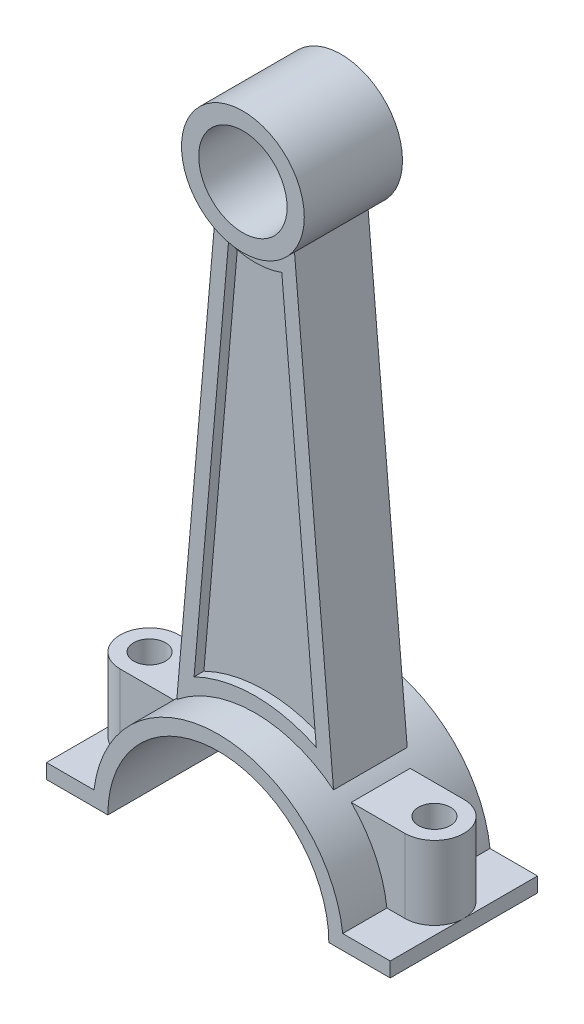
ISO-10303-21;
HEADER;
FILE_DESCRIPTION(('STEP AP214'),'2;1');
FILE_NAME('part.step','',(''),(''),'','','');
FILE_SCHEMA(('AUTOMOTIVE_DESIGN { 1 0 10303 214 1 1 1 1 }'));
ENDSEC;
DATA;
#1=APPLICATION_CONTEXT('core data for automotive mechanical design processes');
#2=APPLICATION_PROTOCOL_DEFINITION('international standard','automotive_design',2000,#1);
#3=PRODUCT_CONTEXT('',#1,'mechanical');
#4=PRODUCT('Part','Part','',(#3));
#5=PRODUCT_RELATED_PRODUCT_CATEGORY('part','',(#4));
#6=PRODUCT_DEFINITION_FORMATION('','',#4);
#7=PRODUCT_DEFINITION_CONTEXT('part definition',#1,'design');
#8=PRODUCT_DEFINITION('design','',#6,#7);
#9=PRODUCT_DEFINITION_SHAPE('','',#8);
#10=(LENGTH_UNIT() NAMED_UNIT(*) SI_UNIT(.MILLI.,.METRE.));
#11=(NAMED_UNIT(*) PLANE_ANGLE_UNIT() SI_UNIT($,.RADIAN.));
#12=(NAMED_UNIT(*) SI_UNIT($,.STERADIAN.) SOLID_ANGLE_UNIT());
#13=UNCERTAINTY_MEASURE_WITH_UNIT(LENGTH_MEASURE(1.E-05),#10,'distance_accuracy_value','');
#14=(GEOMETRIC_REPRESENTATION_CONTEXT(3) GLOBAL_UNCERTAINTY_ASSIGNED_CONTEXT((#13)) GLOBAL_UNIT_ASSIGNED_CONTEXT((#10,
#11,#12)) REPRESENTATION_CONTEXT('',''));
#15=CARTESIAN_POINT('',(0.,0.,0.));
#16=DIRECTION('',(0.,0.,1.));
#17=DIRECTION('',(1.,0.,0.));
#18=AXIS2_PLACEMENT_3D('',#15,#16,#17);
#19=CARTESIAN_POINT('',(0.,0.,-7.5));
#20=DIRECTION('',(0.,0.,1.));
#21=DIRECTION('',(1.,0.,0.));
#22=AXIS2_PLACEMENT_3D('',#19,#20,#21);
#23=PLANE('',#22);
#24=CARTESIAN_POINT('',(0.,0.,-7.5));
#25=DIRECTION('',(0.,0.,-1.));
#26=DIRECTION('',(1.,0.,0.));
#27=AXIS2_PLACEMENT_3D('',#24,#25,#26);
#28=CIRCLE('',#27,25.5);
#29=CARTESIAN_POINT('',(-15.9573776041053,19.89,-7.5));
#30=VERTEX_POINT('',#29);
#31=CARTESIAN_POINT('',(15.9573776041052,19.89,-7.5));
#32=VERTEX_POINT('',#31);
#33=EDGE_CURVE('E877',#30,#32,#28,.T.);
#34=ORIENTED_EDGE('',*,*,#33,.F.);
#35=DIRECTION('',(-0.0871557427476543,-0.996194698091746,0.));
#36=VECTOR('',#35,1.);
#37=CARTESIAN_POINT('',(-15.9573776041053,19.89,-7.5));
#38=LINE('',#37,#36);
#39=CARTESIAN_POINT('',(-8.00378320296385,110.8,-7.5));
#40=VERTEX_POINT('',#39);
#41=EDGE_CURVE('E887',#40,#30,#38,.T.);
#42=ORIENTED_EDGE('',*,*,#41,.F.);
#43=CARTESIAN_POINT('',(0.,120.40153396286,-7.5));
#44=DIRECTION('',(0.,0.,-1.));
#45=DIRECTION('',(-1.,0.,0.));
#46=AXIS2_PLACEMENT_3D('',#43,#44,#45);
#47=CIRCLE('',#46,12.5);
#48=CARTESIAN_POINT('',(8.0037832029638,110.8,-7.5));
#49=VERTEX_POINT('',#48);
#50=EDGE_CURVE('E895',#49,#40,#47,.T.);
#51=ORIENTED_EDGE('',*,*,#50,.F.);
#52=DIRECTION('',(-0.0871557427476548,0.996194698091746,0.));
#53=VECTOR('',#52,1.);
#54=CARTESIAN_POINT('',(15.9573776041052,19.89,-7.5));
#55=LINE('',#54,#53);
#56=EDGE_CURVE('E257',#32,#49,#55,.T.);
#57=ORIENTED_EDGE('',*,*,#56,.F.);
#58=EDGE_LOOP('',(#34,#42,#51,#57));
#59=FACE_BOUND('',#58,.T.);
#60=CARTESIAN_POINT('',(0.,0.,-7.5));
#61=DIRECTION('',(0.,0.,-1.));
#62=DIRECTION('',(1.,0.,0.));
#63=AXIS2_PLACEMENT_3D('',#60,#61,#62);
#64=CIRCLE('',#63,28.5);
#65=CARTESIAN_POINT('',(-12.4428303423228,25.6403192856909,-7.5));
#66=VERTEX_POINT('',#65);
#67=CARTESIAN_POINT('',(12.4428303423228,25.6403192856909,-7.5));
#68=VERTEX_POINT('',#67);
#69=EDGE_CURVE('E55',#66,#68,#64,.T.);
#70=ORIENTED_EDGE('',*,*,#69,.T.);
#71=DIRECTION('',(-0.0871557427476548,0.996194698091746,0.));
#72=VECTOR('',#71,1.);
#73=CARTESIAN_POINT('',(12.4428303423228,25.6403192856909,-7.5));
#74=LINE('',#73,#72);
#75=CARTESIAN_POINT('',(5.4226764308025,105.881045667805,-7.5));
#76=VERTEX_POINT('',#75);
#77=EDGE_CURVE('E809',#68,#76,#74,.T.);
#78=ORIENTED_EDGE('',*,*,#77,.T.);
#79=CARTESIAN_POINT('',(0.,120.40153396286,-7.5));
#80=DIRECTION('',(0.,0.,-1.));
#81=DIRECTION('',(1.,0.,0.));
#82=AXIS2_PLACEMENT_3D('',#79,#80,#81);
#83=CIRCLE('',#82,15.5);
#84=CARTESIAN_POINT('',(-5.42267643080255,105.881045667805,-7.5));
#85=VERTEX_POINT('',#84);
#86=EDGE_CURVE('E825',#76,#85,#83,.T.);
#87=ORIENTED_EDGE('',*,*,#86,.T.);
#88=DIRECTION('',(-0.0871557427476545,-0.996194698091746,0.));
#89=VECTOR('',#88,1.);
#90=CARTESIAN_POINT('',(-5.42267643080254,105.881045667805,-7.5));
#91=LINE('',#90,#89);
#92=EDGE_CURVE('E821',#85,#66,#91,.T.);
#93=ORIENTED_EDGE('',*,*,#92,.T.);
#94=EDGE_LOOP('',(#70,#78,#87,#93));
#95=FACE_BOUND('',#94,.T.);
#96=ADVANCED_FACE('F39',(#59,#95),#23,.F.);
#97=CARTESIAN_POINT('',(0.,0.,15.));
#98=DIRECTION('',(0.,0.,-1.));
#99=DIRECTION('',(-1.,0.,0.));
#100=AXIS2_PLACEMENT_3D('',#97,#98,#99);
#101=CYLINDRICAL_SURFACE('',#100,25.5);
#102=DIRECTION('',(0.,0.,-1.));
#103=VECTOR('',#102,1.);
#104=CARTESIAN_POINT('',(15.9573776041052,19.89,7.5));
#105=LINE('',#104,#103);
#106=CARTESIAN_POINT('',(15.9573776041052,19.89,7.5));
#107=VERTEX_POINT('',#106);
#108=EDGE_CURVE('E260',#107,#32,#105,.T.);
#109=ORIENTED_EDGE('',*,*,#108,.F.);
#110=CARTESIAN_POINT('',(0.,0.,7.5));
#111=DIRECTION('',(0.,0.,-1.));
#112=DIRECTION('',(1.,0.,0.));
#113=AXIS2_PLACEMENT_3D('',#110,#111,#112);
#114=CIRCLE('',#113,25.5);
#115=CARTESIAN_POINT('',(-15.9573776041053,19.89,7.5));
#116=VERTEX_POINT('',#115);
#117=EDGE_CURVE('E250',#116,#107,#114,.T.);
#118=ORIENTED_EDGE('',*,*,#117,.F.);
#119=DIRECTION('',(0.,0.,-1.));
#120=VECTOR('',#119,1.);
#121=CARTESIAN_POINT('',(-15.9573776041053,19.89,7.5));
#122=LINE('',#121,#120);
#123=EDGE_CURVE('E266',#116,#30,#122,.T.);
#124=ORIENTED_EDGE('',*,*,#123,.T.);
#125=ORIENTED_EDGE('',*,*,#33,.T.);
#126=EDGE_LOOP('',(#109,#118,#124,#125));
#127=FACE_BOUND('',#126,.T.);
#128=CARTESIAN_POINT('',(0.,0.,6.));
#129=DIRECTION('',(0.,0.,-1.));
#130=DIRECTION('',(-1.,0.,0.));
#131=AXIS2_PLACEMENT_3D('',#128,#129,#130);
#132=CIRCLE('',#131,25.5);
#133=CARTESIAN_POINT('',(25.3229145242012,3.,6.));
#134=VERTEX_POINT('',#133);
#135=CARTESIAN_POINT('',(18.0623918681884,18.,6.));
#136=VERTEX_POINT('',#135);
#137=EDGE_CURVE('E304',#134,#136,#132,.F.);
#138=ORIENTED_EDGE('',*,*,#137,.T.);
#139=DIRECTION('',(0.,0.,-1.));
#140=VECTOR('',#139,1.);
#141=CARTESIAN_POINT('',(18.0623918681884,18.,15.));
#142=LINE('',#141,#140);
#143=CARTESIAN_POINT('',(18.0623918681884,18.,-6.));
#144=VERTEX_POINT('',#143);
#145=EDGE_CURVE('E295',#144,#136,#142,.F.);
#146=ORIENTED_EDGE('',*,*,#145,.F.);
#147=CARTESIAN_POINT('',(0.,0.,-6.));
#148=DIRECTION('',(0.,0.,1.));
#149=DIRECTION('',(1.,0.,0.));
#150=AXIS2_PLACEMENT_3D('',#147,#148,#149);
#151=CIRCLE('',#150,25.5);
#152=CARTESIAN_POINT('',(25.3229145242012,3.,-6.));
#153=VERTEX_POINT('',#152);
#154=EDGE_CURVE('E308',#144,#153,#151,.F.);
#155=ORIENTED_EDGE('',*,*,#154,.T.);
#156=DIRECTION('',(0.,0.,-1.));
#157=VECTOR('',#156,1.);
#158=CARTESIAN_POINT('',(25.3229145242012,3.,15.));
#159=LINE('',#158,#157);
#160=CARTESIAN_POINT('',(25.3229145242012,3.,-15.));
#161=VERTEX_POINT('',#160);
#162=EDGE_CURVE('E387',#153,#161,#159,.T.);
#163=ORIENTED_EDGE('',*,*,#162,.T.);
#164=CARTESIAN_POINT('',(0.,0.,-15.));
#165=DIRECTION('',(0.,0.,1.));
#166=DIRECTION('',(-1.,0.,0.));
#167=AXIS2_PLACEMENT_3D('',#164,#165,#166);
#168=CIRCLE('',#167,25.5);
#169=CARTESIAN_POINT('',(-25.3229145242012,3.,-15.));
#170=VERTEX_POINT('',#169);
#171=EDGE_CURVE('E360',#161,#170,#168,.T.);
#172=ORIENTED_EDGE('',*,*,#171,.T.);
#173=DIRECTION('',(0.,0.,-1.));
#174=VECTOR('',#173,1.);
#175=CARTESIAN_POINT('',(-25.3229145242012,3.,15.));
#176=LINE('',#175,#174);
#177=CARTESIAN_POINT('',(-25.3229145242012,3.,-6.));
#178=VERTEX_POINT('',#177);
#179=EDGE_CURVE('E443',#178,#170,#176,.T.);
#180=ORIENTED_EDGE('',*,*,#179,.F.);
#181=CARTESIAN_POINT('',(0.,0.,-6.));
#182=DIRECTION('',(0.,0.,-1.));
#183=DIRECTION('',(-1.,0.,0.));
#184=AXIS2_PLACEMENT_3D('',#181,#182,#183);
#185=CIRCLE('',#184,25.5);
#186=CARTESIAN_POINT('',(-18.0623918681884,18.,-6.));
#187=VERTEX_POINT('',#186);
#188=EDGE_CURVE('E351',#187,#178,#185,.F.);
#189=ORIENTED_EDGE('',*,*,#188,.F.);
#190=DIRECTION('',(0.,0.,-1.));
#191=VECTOR('',#190,1.);
#192=CARTESIAN_POINT('',(-18.0623918681884,18.,15.));
#193=LINE('',#192,#191);
#194=CARTESIAN_POINT('',(-18.0623918681884,18.,6.));
#195=VERTEX_POINT('',#194);
#196=EDGE_CURVE('E339',#195,#187,#193,.T.);
#197=ORIENTED_EDGE('',*,*,#196,.F.);
#198=CARTESIAN_POINT('',(0.,0.,6.));
#199=DIRECTION('',(0.,0.,1.));
#200=DIRECTION('',(1.,0.,0.));
#201=AXIS2_PLACEMENT_3D('',#198,#199,#200);
#202=CIRCLE('',#201,25.5);
#203=CARTESIAN_POINT('',(-25.3229145242012,3.,6.));
#204=VERTEX_POINT('',#203);
#205=EDGE_CURVE('E344',#204,#195,#202,.F.);
#206=ORIENTED_EDGE('',*,*,#205,.F.);
#207=CARTESIAN_POINT('',(-25.3229145242012,3.,15.));
#208=VERTEX_POINT('',#207);
#209=EDGE_CURVE('E48',#208,#204,#176,.T.);
#210=ORIENTED_EDGE('',*,*,#209,.F.);
#211=CARTESIAN_POINT('',(0.,0.,15.));
#212=DIRECTION('',(0.,0.,1.));
#213=DIRECTION('',(-1.,0.,0.));
#214=AXIS2_PLACEMENT_3D('',#211,#212,#213);
#215=CIRCLE('',#214,25.5);
#216=CARTESIAN_POINT('',(25.3229145242012,3.,15.));
#217=VERTEX_POINT('',#216);
#218=EDGE_CURVE('E361',#217,#208,#215,.T.);
#219=ORIENTED_EDGE('',*,*,#218,.F.);
#220=EDGE_CURVE('E414',#217,#134,#159,.T.);
#221=ORIENTED_EDGE('',*,*,#220,.T.);
#222=EDGE_LOOP('',(#138,#146,#155,#163,#172,#180,#189,#197,#206,#210,#219,#221));
#223=FACE_BOUND('',#222,.T.);
#224=ADVANCED_FACE('F41',(#127,#223),#101,.T.);
#225=CARTESIAN_POINT('',(35.,3.,15.));
#226=DIRECTION('',(0.,-1.,0.));
#227=DIRECTION('',(0.,0.,-1.));
#228=AXIS2_PLACEMENT_3D('',#225,#226,#227);
#229=PLANE('',#228);
#230=DIRECTION('',(-1.,0.,0.));
#231=VECTOR('',#230,1.);
#232=CARTESIAN_POINT('',(18.06,3.,6.));
#233=LINE('',#232,#231);
#234=CARTESIAN_POINT('',(29.,3.,6.));
#235=VERTEX_POINT('',#234);
#236=EDGE_CURVE('E307',#235,#134,#233,.T.);
#237=ORIENTED_EDGE('',*,*,#236,.T.);
#238=ORIENTED_EDGE('',*,*,#220,.F.);
#239=DIRECTION('',(-1.,0.,0.));
#240=VECTOR('',#239,1.);
#241=CARTESIAN_POINT('',(35.,3.,15.));
#242=LINE('',#241,#240);
#243=CARTESIAN_POINT('',(35.,3.,15.));
#244=VERTEX_POINT('',#243);
#245=EDGE_CURVE('E384',#244,#217,#242,.T.);
#246=ORIENTED_EDGE('',*,*,#245,.F.);
#247=DIRECTION('',(0.,0.,-1.));
#248=VECTOR('',#247,1.);
#249=CARTESIAN_POINT('',(35.,3.,15.));
#250=LINE('',#249,#248);
#251=CARTESIAN_POINT('',(35.,3.,0.));
#252=VERTEX_POINT('',#251);
#253=EDGE_CURVE('E419',#244,#252,#250,.T.);
#254=ORIENTED_EDGE('',*,*,#253,.T.);
#255=CARTESIAN_POINT('',(29.,3.,0.));
#256=DIRECTION('',(0.,-1.,0.));
#257=DIRECTION('',(0.,0.,-1.));
#258=AXIS2_PLACEMENT_3D('',#255,#256,#257);
#259=CIRCLE('',#258,6.);
#260=EDGE_CURVE('E11',#235,#252,#259,.F.);
#261=ORIENTED_EDGE('',*,*,#260,.F.);
#262=EDGE_LOOP('',(#237,#238,#246,#254,#261));
#263=FACE_BOUND('',#262,.T.);
#264=ADVANCED_FACE('F532',(#263),#229,.F.);
#265=CARTESIAN_POINT('',(29.,3.,0.));
#266=DIRECTION('',(0.,-1.,0.));
#267=DIRECTION('',(0.,0.,-1.));
#268=AXIS2_PLACEMENT_3D('',#265,#266,#267);
#269=CIRCLE('',#268,6.);
#270=CARTESIAN_POINT('',(29.,3.,-6.));
#271=VERTEX_POINT('',#270);
#272=EDGE_CURVE('E300',#271,#252,#269,.T.);
#273=ORIENTED_EDGE('',*,*,#272,.T.);
#274=CARTESIAN_POINT('',(35.,3.,-15.));
#275=VERTEX_POINT('',#274);
#276=EDGE_CURVE('E418',#252,#275,#250,.T.);
#277=ORIENTED_EDGE('',*,*,#276,.T.);
#278=DIRECTION('',(-1.,0.,0.));
#279=VECTOR('',#278,1.);
#280=CARTESIAN_POINT('',(35.,3.,-15.));
#281=LINE('',#280,#279);
#282=EDGE_CURVE('E366',#275,#161,#281,.T.);
#283=ORIENTED_EDGE('',*,*,#282,.T.);
#284=ORIENTED_EDGE('',*,*,#162,.F.);
#285=DIRECTION('',(1.,0.,0.));
#286=VECTOR('',#285,1.);
#287=CARTESIAN_POINT('',(18.06,3.,-6.));
#288=LINE('',#287,#286);
#289=EDGE_CURVE('E299',#153,#271,#288,.T.);
#290=ORIENTED_EDGE('',*,*,#289,.T.);
#291=EDGE_LOOP('',(#273,#277,#283,#284,#290));
#292=FACE_BOUND('',#291,.T.);
#293=ADVANCED_FACE('F469',(#292),#229,.F.);
#294=CARTESIAN_POINT('',(-35.,2.99999999999999,15.));
#295=DIRECTION('',(0.,-1.,0.));
#296=DIRECTION('',(1.,0.,0.));
#297=AXIS2_PLACEMENT_3D('',#294,#295,#296);
#298=PLANE('',#297);
#299=CARTESIAN_POINT('',(-29.,3.,0.));
#300=DIRECTION('',(0.,-1.,0.));
#301=DIRECTION('',(1.,0.,0.));
#302=AXIS2_PLACEMENT_3D('',#299,#300,#301);
#303=CIRCLE('',#302,6.);
#304=CARTESIAN_POINT('',(-29.,3.,-6.));
#305=VERTEX_POINT('',#304);
#306=CARTESIAN_POINT('',(-35.,2.99999999999999,0.));
#307=VERTEX_POINT('',#306);
#308=EDGE_CURVE('E355',#305,#307,#303,.F.);
#309=ORIENTED_EDGE('',*,*,#308,.F.);
#310=DIRECTION('',(-1.,0.,0.));
#311=VECTOR('',#310,1.);
#312=CARTESIAN_POINT('',(-18.06,3.,-6.));
#313=LINE('',#312,#311);
#314=EDGE_CURVE('E354',#178,#305,#313,.T.);
#315=ORIENTED_EDGE('',*,*,#314,.F.);
#316=ORIENTED_EDGE('',*,*,#179,.T.);
#317=DIRECTION('',(-1.,0.,0.));
#318=VECTOR('',#317,1.);
#319=CARTESIAN_POINT('',(-35.,2.99999999999999,-15.));
#320=LINE('',#319,#318);
#321=CARTESIAN_POINT('',(-35.,2.99999999999999,-15.));
#322=VERTEX_POINT('',#321);
#323=EDGE_CURVE('E391',#170,#322,#320,.T.);
#324=ORIENTED_EDGE('',*,*,#323,.T.);
#325=DIRECTION('',(0.,0.,-1.));
#326=VECTOR('',#325,1.);
#327=CARTESIAN_POINT('',(-35.,2.99999999999999,15.));
#328=LINE('',#327,#326);
#329=EDGE_CURVE('E439',#307,#322,#328,.T.);
#330=ORIENTED_EDGE('',*,*,#329,.F.);
#331=EDGE_LOOP('',(#309,#315,#316,#324,#330));
#332=FACE_BOUND('',#331,.T.);
#333=ADVANCED_FACE('F455',(#332),#298,.F.);
#334=DIRECTION('',(1.,0.,0.));
#335=VECTOR('',#334,1.);
#336=CARTESIAN_POINT('',(-18.06,3.,6.));
#337=LINE('',#336,#335);
#338=CARTESIAN_POINT('',(-29.,3.,6.));
#339=VERTEX_POINT('',#338);
#340=EDGE_CURVE('E345',#339,#204,#337,.T.);
#341=ORIENTED_EDGE('',*,*,#340,.F.);
#342=EDGE_CURVE('E348',#307,#339,#303,.F.);
#343=ORIENTED_EDGE('',*,*,#342,.F.);
#344=CARTESIAN_POINT('',(-35.,2.99999999999999,15.));
#345=VERTEX_POINT('',#344);
#346=EDGE_CURVE('E440',#345,#307,#328,.T.);
#347=ORIENTED_EDGE('',*,*,#346,.F.);
#348=DIRECTION('',(-1.,0.,0.));
#349=VECTOR('',#348,1.);
#350=CARTESIAN_POINT('',(-35.,2.99999999999999,15.));
#351=LINE('',#350,#349);
#352=EDGE_CURVE('E365',#208,#345,#351,.T.);
#353=ORIENTED_EDGE('',*,*,#352,.F.);
#354=ORIENTED_EDGE('',*,*,#209,.T.);
#355=EDGE_LOOP('',(#341,#343,#347,#353,#354));
#356=FACE_BOUND('',#355,.T.);
#357=ADVANCED_FACE('F505',(#356),#298,.F.);
#358=CARTESIAN_POINT('',(-35.,0.,15.));
#359=DIRECTION('',(1.,0.,0.));
#360=DIRECTION('',(0.,0.,-1.));
#361=AXIS2_PLACEMENT_3D('',#358,#359,#360);
#362=PLANE('',#361);
#363=DIRECTION('',(0.,-1.,0.));
#364=VECTOR('',#363,1.);
#365=CARTESIAN_POINT('',(-35.,0.,-15.));
#366=LINE('',#365,#364);
#367=CARTESIAN_POINT('',(-35.,0.,-15.));
#368=VERTEX_POINT('',#367);
#369=EDGE_CURVE('E395',#322,#368,#366,.T.);
#370=ORIENTED_EDGE('',*,*,#369,.T.);
#371=DIRECTION('',(0.,0.,-1.));
#372=VECTOR('',#371,1.);
#373=CARTESIAN_POINT('',(-35.,0.,15.));
#374=LINE('',#373,#372);
#375=CARTESIAN_POINT('',(-35.,0.,15.));
#376=VERTEX_POINT('',#375);
#377=EDGE_CURVE('E435',#376,#368,#374,.T.);
#378=ORIENTED_EDGE('',*,*,#377,.F.);
#379=DIRECTION('',(0.,-1.,0.));
#380=VECTOR('',#379,1.);
#381=CARTESIAN_POINT('',(-35.,0.,15.));
#382=LINE('',#381,#380);
#383=EDGE_CURVE('E369',#345,#376,#382,.T.);
#384=ORIENTED_EDGE('',*,*,#383,.F.);
#385=ORIENTED_EDGE('',*,*,#346,.T.);
#386=ORIENTED_EDGE('',*,*,#329,.T.);
#387=EDGE_LOOP('',(#370,#378,#384,#385,#386));
#388=FACE_BOUND('',#387,.T.);
#389=ADVANCED_FACE('F493',(#388),#362,.F.);
#390=CARTESIAN_POINT('',(-22.5,0.,15.));
#391=DIRECTION('',(0.,1.,0.));
#392=DIRECTION('',(-1.,0.,0.));
#393=AXIS2_PLACEMENT_3D('',#390,#391,#392);
#394=PLANE('',#393);
#395=CARTESIAN_POINT('',(-29.,0.,0.));
#396=DIRECTION('',(0.,1.,0.));
#397=DIRECTION('',(-1.,0.,0.));
#398=AXIS2_PLACEMENT_3D('',#395,#396,#397);
#399=CIRCLE('',#398,3.25);
#400=CARTESIAN_POINT('',(-32.25,0.,0.));
#401=VERTEX_POINT('',#400);
#402=EDGE_CURVE('E316',#401,#401,#399,.T.);
#403=ORIENTED_EDGE('',*,*,#402,.T.);
#404=EDGE_LOOP('',(#403));
#405=FACE_BOUND('',#404,.T.);
#406=DIRECTION('',(1.,0.,0.));
#407=VECTOR('',#406,1.);
#408=CARTESIAN_POINT('',(-22.5,0.,-15.));
#409=LINE('',#408,#407);
#410=CARTESIAN_POINT('',(-22.5,0.,-15.));
#411=VERTEX_POINT('',#410);
#412=EDGE_CURVE('E398',#368,#411,#409,.T.);
#413=ORIENTED_EDGE('',*,*,#412,.T.);
#414=DIRECTION('',(0.,0.,-1.));
#415=VECTOR('',#414,1.);
#416=CARTESIAN_POINT('',(-22.5,0.,15.));
#417=LINE('',#416,#415);
#418=CARTESIAN_POINT('',(-22.5,0.,15.));
#419=VERTEX_POINT('',#418);
#420=EDGE_CURVE('E431',#419,#411,#417,.T.);
#421=ORIENTED_EDGE('',*,*,#420,.F.);
#422=DIRECTION('',(1.,0.,0.));
#423=VECTOR('',#422,1.);
#424=CARTESIAN_POINT('',(-22.5,0.,15.));
#425=LINE('',#424,#423);
#426=EDGE_CURVE('E372',#376,#419,#425,.T.);
#427=ORIENTED_EDGE('',*,*,#426,.F.);
#428=ORIENTED_EDGE('',*,*,#377,.T.);
#429=EDGE_LOOP('',(#413,#421,#427,#428));
#430=FACE_BOUND('',#429,.T.);
#431=ADVANCED_FACE('F488',(#405,#430),#394,.F.);
#432=CARTESIAN_POINT('',(0.,0.,15.));
#433=DIRECTION('',(0.,0.,-1.));
#434=DIRECTION('',(-1.,0.,0.));
#435=AXIS2_PLACEMENT_3D('',#432,#433,#434);
#436=CYLINDRICAL_SURFACE('',#435,22.5);
#437=CARTESIAN_POINT('',(0.,0.,-15.));
#438=DIRECTION('',(0.,0.,-1.));
#439=DIRECTION('',(-1.,0.,0.));
#440=AXIS2_PLACEMENT_3D('',#437,#438,#439);
#441=CIRCLE('',#440,22.5);
#442=CARTESIAN_POINT('',(22.5,0.,-15.));
#443=VERTEX_POINT('',#442);
#444=EDGE_CURVE('E401',#411,#443,#441,.T.);
#445=ORIENTED_EDGE('',*,*,#444,.T.);
#446=DIRECTION('',(0.,0.,-1.));
#447=VECTOR('',#446,1.);
#448=CARTESIAN_POINT('',(22.5,0.,15.));
#449=LINE('',#448,#447);
#450=CARTESIAN_POINT('',(22.5,0.,15.));
#451=VERTEX_POINT('',#450);
#452=EDGE_CURVE('E427',#451,#443,#449,.T.);
#453=ORIENTED_EDGE('',*,*,#452,.F.);
#454=CARTESIAN_POINT('',(0.,0.,15.));
#455=DIRECTION('',(0.,0.,-1.));
#456=DIRECTION('',(-1.,0.,0.));
#457=AXIS2_PLACEMENT_3D('',#454,#455,#456);
#458=CIRCLE('',#457,22.5);
#459=EDGE_CURVE('E375',#419,#451,#458,.T.);
#460=ORIENTED_EDGE('',*,*,#459,.F.);
#461=ORIENTED_EDGE('',*,*,#420,.T.);
#462=EDGE_LOOP('',(#445,#453,#460,#461));
#463=FACE_BOUND('',#462,.T.);
#464=ADVANCED_FACE('F485',(#463),#436,.F.);
#465=CARTESIAN_POINT('',(22.5,0.,15.));
#466=DIRECTION('',(0.,1.,0.));
#467=DIRECTION('',(0.,0.,1.));
#468=AXIS2_PLACEMENT_3D('',#465,#466,#467);
#469=PLANE('',#468);
#470=CARTESIAN_POINT('',(29.,0.,0.));
#471=DIRECTION('',(0.,-1.,0.));
#472=DIRECTION('',(1.,0.,0.));
#473=AXIS2_PLACEMENT_3D('',#470,#471,#472);
#474=CIRCLE('',#473,3.25);
#475=CARTESIAN_POINT('',(32.25,0.,0.));
#476=VERTEX_POINT('',#475);
#477=EDGE_CURVE('E270',#476,#476,#474,.T.);
#478=ORIENTED_EDGE('',*,*,#477,.F.);
#479=EDGE_LOOP('',(#478));
#480=FACE_BOUND('',#479,.T.);
#481=DIRECTION('',(1.,0.,0.));
#482=VECTOR('',#481,1.);
#483=CARTESIAN_POINT('',(22.5,0.,-15.));
#484=LINE('',#483,#482);
#485=CARTESIAN_POINT('',(35.,0.,-15.));
#486=VERTEX_POINT('',#485);
#487=EDGE_CURVE('E404',#443,#486,#484,.T.);
#488=ORIENTED_EDGE('',*,*,#487,.T.);
#489=DIRECTION('',(0.,0.,-1.));
#490=VECTOR('',#489,1.);
#491=CARTESIAN_POINT('',(35.,0.,15.));
#492=LINE('',#491,#490);
#493=CARTESIAN_POINT('',(35.,0.,15.));
#494=VERTEX_POINT('',#493);
#495=EDGE_CURVE('E423',#494,#486,#492,.T.);
#496=ORIENTED_EDGE('',*,*,#495,.F.);
#497=DIRECTION('',(1.,0.,0.));
#498=VECTOR('',#497,1.);
#499=CARTESIAN_POINT('',(22.5,0.,15.));
#500=LINE('',#499,#498);
#501=EDGE_CURVE('E378',#451,#494,#500,.T.);
#502=ORIENTED_EDGE('',*,*,#501,.F.);
#503=ORIENTED_EDGE('',*,*,#452,.T.);
#504=EDGE_LOOP('',(#488,#496,#502,#503));
#505=FACE_BOUND('',#504,.T.);
#506=ADVANCED_FACE('F481',(#480,#505),#469,.F.);
#507=CARTESIAN_POINT('',(35.,0.,15.));
#508=DIRECTION('',(-1.,0.,0.));
#509=DIRECTION('',(0.,0.,1.));
#510=AXIS2_PLACEMENT_3D('',#507,#508,#509);
#511=PLANE('',#510);
#512=DIRECTION('',(0.,1.,0.));
#513=VECTOR('',#512,1.);
#514=CARTESIAN_POINT('',(35.,0.,-15.));
#515=LINE('',#514,#513);
#516=EDGE_CURVE('E407',#486,#275,#515,.T.);
#517=ORIENTED_EDGE('',*,*,#516,.T.);
#518=ORIENTED_EDGE('',*,*,#276,.F.);
#519=ORIENTED_EDGE('',*,*,#253,.F.);
#520=DIRECTION('',(0.,1.,0.));
#521=VECTOR('',#520,1.);
#522=CARTESIAN_POINT('',(35.,0.,15.));
#523=LINE('',#522,#521);
#524=EDGE_CURVE('E381',#494,#244,#523,.T.);
#525=ORIENTED_EDGE('',*,*,#524,.F.);
#526=ORIENTED_EDGE('',*,*,#495,.T.);
#527=EDGE_LOOP('',(#517,#518,#519,#525,#526));
#528=FACE_BOUND('',#527,.T.);
#529=ADVANCED_FACE('F475',(#528),#511,.F.);
#530=CARTESIAN_POINT('',(0.,0.,15.));
#531=DIRECTION('',(0.,0.,-1.));
#532=DIRECTION('',(-1.,0.,0.));
#533=AXIS2_PLACEMENT_3D('',#530,#531,#532);
#534=PLANE('',#533);
#535=ORIENTED_EDGE('',*,*,#218,.T.);
#536=ORIENTED_EDGE('',*,*,#352,.T.);
#537=ORIENTED_EDGE('',*,*,#383,.T.);
#538=ORIENTED_EDGE('',*,*,#426,.T.);
#539=ORIENTED_EDGE('',*,*,#459,.T.);
#540=ORIENTED_EDGE('',*,*,#501,.T.);
#541=ORIENTED_EDGE('',*,*,#524,.T.);
#542=ORIENTED_EDGE('',*,*,#245,.T.);
#543=EDGE_LOOP('',(#535,#536,#537,#538,#539,#540,#541,#542));
#544=FACE_BOUND('',#543,.T.);
#545=ADVANCED_FACE('F574',(#544),#534,.F.);
#546=CARTESIAN_POINT('',(0.,0.,-15.));
#547=DIRECTION('',(0.,0.,-1.));
#548=DIRECTION('',(-1.,0.,0.));
#549=AXIS2_PLACEMENT_3D('',#546,#547,#548);
#550=PLANE('',#549);
#551=ORIENTED_EDGE('',*,*,#171,.F.);
#552=ORIENTED_EDGE('',*,*,#282,.F.);
#553=ORIENTED_EDGE('',*,*,#516,.F.);
#554=ORIENTED_EDGE('',*,*,#487,.F.);
#555=ORIENTED_EDGE('',*,*,#444,.F.);
#556=ORIENTED_EDGE('',*,*,#412,.F.);
#557=ORIENTED_EDGE('',*,*,#369,.F.);
#558=ORIENTED_EDGE('',*,*,#323,.F.);
#559=EDGE_LOOP('',(#551,#552,#553,#554,#555,#556,#557,#558));
#560=FACE_BOUND('',#559,.T.);
#561=ADVANCED_FACE('F462',(#560),#550,.T.);
#562=CARTESIAN_POINT('',(-29.,-0.00199999999999853,0.));
#563=DIRECTION('',(0.,1.,0.));
#564=DIRECTION('',(-1.,0.,0.));
#565=AXIS2_PLACEMENT_3D('',#562,#563,#564);
#566=CYLINDRICAL_SURFACE('',#565,6.);
#567=DIRECTION('',(0.,1.,0.));
#568=VECTOR('',#567,1.);
#569=CARTESIAN_POINT('',(-29.,-0.00199999999999853,-6.));
#570=LINE('',#569,#568);
#571=CARTESIAN_POINT('',(-29.,18.,-6.));
#572=VERTEX_POINT('',#571);
#573=EDGE_CURVE('E336',#305,#572,#570,.T.);
#574=ORIENTED_EDGE('',*,*,#573,.F.);
#575=ORIENTED_EDGE('',*,*,#308,.T.);
#576=ORIENTED_EDGE('',*,*,#342,.T.);
#577=DIRECTION('',(0.,1.,0.));
#578=VECTOR('',#577,1.);
#579=CARTESIAN_POINT('',(-29.,-0.00199999999999853,6.));
#580=LINE('',#579,#578);
#581=CARTESIAN_POINT('',(-29.,18.,6.));
#582=VERTEX_POINT('',#581);
#583=EDGE_CURVE('E335',#339,#582,#580,.T.);
#584=ORIENTED_EDGE('',*,*,#583,.T.);
#585=CARTESIAN_POINT('',(-29.,18.,0.));
#586=DIRECTION('',(0.,1.,0.));
#587=DIRECTION('',(-1.,0.,0.));
#588=AXIS2_PLACEMENT_3D('',#585,#586,#587);
#589=CIRCLE('',#588,6.);
#590=EDGE_CURVE('E324',#572,#582,#589,.T.);
#591=ORIENTED_EDGE('',*,*,#590,.F.);
#592=EDGE_LOOP('',(#574,#575,#576,#584,#591));
#593=FACE_BOUND('',#592,.T.);
#594=ADVANCED_FACE('F502',(#593),#566,.T.);
#595=CARTESIAN_POINT('',(-18.06,-0.00199999999999853,-6.));
#596=DIRECTION('',(0.,0.,-1.));
#597=DIRECTION('',(-1.,0.,0.));
#598=AXIS2_PLACEMENT_3D('',#595,#596,#597);
#599=PLANE('',#598);
#600=ORIENTED_EDGE('',*,*,#188,.T.);
#601=ORIENTED_EDGE('',*,*,#314,.T.);
#602=ORIENTED_EDGE('',*,*,#573,.T.);
#603=DIRECTION('',(-1.,0.,0.));
#604=VECTOR('',#603,1.);
#605=CARTESIAN_POINT('',(-18.06,18.,-6.));
#606=LINE('',#605,#604);
#607=EDGE_CURVE('E320',#187,#572,#606,.T.);
#608=ORIENTED_EDGE('',*,*,#607,.F.);
#609=EDGE_LOOP('',(#600,#601,#602,#608));
#610=FACE_BOUND('',#609,.T.);
#611=ADVANCED_FACE('F515',(#610),#599,.T.);
#612=CARTESIAN_POINT('',(-18.06,-0.00199999999999853,6.));
#613=DIRECTION('',(0.,0.,1.));
#614=DIRECTION('',(1.,0.,0.));
#615=AXIS2_PLACEMENT_3D('',#612,#613,#614);
#616=PLANE('',#615);
#617=ORIENTED_EDGE('',*,*,#583,.F.);
#618=ORIENTED_EDGE('',*,*,#340,.T.);
#619=ORIENTED_EDGE('',*,*,#205,.T.);
#620=DIRECTION('',(1.,0.,0.));
#621=VECTOR('',#620,1.);
#622=CARTESIAN_POINT('',(-18.06,18.,6.));
#623=LINE('',#622,#621);
#624=EDGE_CURVE('E328',#582,#195,#623,.T.);
#625=ORIENTED_EDGE('',*,*,#624,.F.);
#626=EDGE_LOOP('',(#617,#618,#619,#625));
#627=FACE_BOUND('',#626,.T.);
#628=ADVANCED_FACE('F508',(#627),#616,.T.);
#629=CARTESIAN_POINT('',(-29.,18.,0.));
#630=DIRECTION('',(0.,1.,0.));
#631=DIRECTION('',(-1.,0.,0.));
#632=AXIS2_PLACEMENT_3D('',#629,#630,#631);
#633=PLANE('',#632);
#634=CARTESIAN_POINT('',(-29.,18.,0.));
#635=DIRECTION('',(0.,1.,0.));
#636=DIRECTION('',(-1.,0.,0.));
#637=AXIS2_PLACEMENT_3D('',#634,#635,#636);
#638=CIRCLE('',#637,3.25);
#639=CARTESIAN_POINT('',(-32.25,18.,0.));
#640=VERTEX_POINT('',#639);
#641=EDGE_CURVE('E303',#640,#640,#638,.T.);
#642=ORIENTED_EDGE('',*,*,#641,.F.);
#643=EDGE_LOOP('',(#642));
#644=FACE_BOUND('',#643,.T.);
#645=ORIENTED_EDGE('',*,*,#624,.T.);
#646=ORIENTED_EDGE('',*,*,#196,.T.);
#647=ORIENTED_EDGE('',*,*,#607,.T.);
#648=ORIENTED_EDGE('',*,*,#590,.T.);
#649=EDGE_LOOP('',(#645,#646,#647,#648));
#650=FACE_BOUND('',#649,.T.);
#651=ADVANCED_FACE('F513',(#644,#650),#633,.T.);
#652=CARTESIAN_POINT('',(-29.,0.,0.));
#653=DIRECTION('',(0.,1.,0.));
#654=DIRECTION('',(-1.,0.,0.));
#655=AXIS2_PLACEMENT_3D('',#652,#653,#654);
#656=CYLINDRICAL_SURFACE('',#655,3.25);
#657=ORIENTED_EDGE('',*,*,#402,.F.);
#658=EDGE_LOOP('',(#657));
#659=FACE_BOUND('',#658,.T.);
#660=ORIENTED_EDGE('',*,*,#641,.T.);
#661=EDGE_LOOP('',(#660));
#662=FACE_BOUND('',#661,.T.);
#663=ADVANCED_FACE('F524',(#659,#662),#656,.F.);
#664=CARTESIAN_POINT('',(29.,-0.00199999999999853,0.));
#665=DIRECTION('',(0.,1.,0.));
#666=DIRECTION('',(-1.,0.,0.));
#667=AXIS2_PLACEMENT_3D('',#664,#665,#666);
#668=CYLINDRICAL_SURFACE('',#667,6.);
#669=DIRECTION('',(0.,1.,0.));
#670=VECTOR('',#669,1.);
#671=CARTESIAN_POINT('',(29.,-0.00199999999999853,6.));
#672=LINE('',#671,#670);
#673=CARTESIAN_POINT('',(29.,18.,6.));
#674=VERTEX_POINT('',#673);
#675=EDGE_CURVE('E292',#235,#674,#672,.T.);
#676=ORIENTED_EDGE('',*,*,#675,.F.);
#677=ORIENTED_EDGE('',*,*,#260,.T.);
#678=ORIENTED_EDGE('',*,*,#272,.F.);
#679=DIRECTION('',(0.,1.,0.));
#680=VECTOR('',#679,1.);
#681=CARTESIAN_POINT('',(29.,-0.00199999999999853,-6.));
#682=LINE('',#681,#680);
#683=CARTESIAN_POINT('',(29.,18.,-6.));
#684=VERTEX_POINT('',#683);
#685=EDGE_CURVE('E289',#271,#684,#682,.T.);
#686=ORIENTED_EDGE('',*,*,#685,.T.);
#687=CARTESIAN_POINT('',(29.,18.,0.));
#688=DIRECTION('',(0.,-1.,0.));
#689=DIRECTION('',(1.,0.,0.));
#690=AXIS2_PLACEMENT_3D('',#687,#688,#689);
#691=CIRCLE('',#690,6.);
#692=EDGE_CURVE('E278',#684,#674,#691,.T.);
#693=ORIENTED_EDGE('',*,*,#692,.T.);
#694=EDGE_LOOP('',(#676,#677,#678,#686,#693));
#695=FACE_BOUND('',#694,.T.);
#696=ADVANCED_FACE('F550',(#695),#668,.T.);
#697=CARTESIAN_POINT('',(18.06,-0.00199999999999853,6.));
#698=DIRECTION('',(0.,0.,-1.));
#699=DIRECTION('',(-1.,0.,0.));
#700=AXIS2_PLACEMENT_3D('',#697,#698,#699);
#701=PLANE('',#700);
#702=ORIENTED_EDGE('',*,*,#236,.F.);
#703=ORIENTED_EDGE('',*,*,#675,.T.);
#704=DIRECTION('',(-1.,0.,0.));
#705=VECTOR('',#704,1.);
#706=CARTESIAN_POINT('',(18.06,18.,6.));
#707=LINE('',#706,#705);
#708=EDGE_CURVE('E282',#674,#136,#707,.T.);
#709=ORIENTED_EDGE('',*,*,#708,.T.);
#710=ORIENTED_EDGE('',*,*,#137,.F.);
#711=EDGE_LOOP('',(#702,#703,#709,#710));
#712=FACE_BOUND('',#711,.T.);
#713=ADVANCED_FACE('F555',(#712),#701,.F.);
#714=CARTESIAN_POINT('',(18.06,-0.00199999999999853,-6.));
#715=DIRECTION('',(0.,0.,1.));
#716=DIRECTION('',(1.,0.,0.));
#717=AXIS2_PLACEMENT_3D('',#714,#715,#716);
#718=PLANE('',#717);
#719=ORIENTED_EDGE('',*,*,#289,.F.);
#720=ORIENTED_EDGE('',*,*,#154,.F.);
#721=DIRECTION('',(1.,0.,0.));
#722=VECTOR('',#721,1.);
#723=CARTESIAN_POINT('',(18.06,18.,-6.));
#724=LINE('',#723,#722);
#725=EDGE_CURVE('E274',#144,#684,#724,.T.);
#726=ORIENTED_EDGE('',*,*,#725,.T.);
#727=ORIENTED_EDGE('',*,*,#685,.F.);
#728=EDGE_LOOP('',(#719,#720,#726,#727));
#729=FACE_BOUND('',#728,.T.);
#730=ADVANCED_FACE('F553',(#729),#718,.F.);
#731=CARTESIAN_POINT('',(29.,18.,0.));
#732=DIRECTION('',(0.,1.,0.));
#733=DIRECTION('',(1.,0.,0.));
#734=AXIS2_PLACEMENT_3D('',#731,#732,#733);
#735=PLANE('',#734);
#736=CARTESIAN_POINT('',(29.,18.,0.));
#737=DIRECTION('',(0.,-1.,0.));
#738=DIRECTION('',(1.,0.,0.));
#739=AXIS2_PLACEMENT_3D('',#736,#737,#738);
#740=CIRCLE('',#739,3.25);
#741=CARTESIAN_POINT('',(32.25,18.,0.));
#742=VERTEX_POINT('',#741);
#743=EDGE_CURVE('E264',#742,#742,#740,.T.);
#744=ORIENTED_EDGE('',*,*,#743,.T.);
#745=EDGE_LOOP('',(#744));
#746=FACE_BOUND('',#745,.T.);
#747=ORIENTED_EDGE('',*,*,#725,.F.);
#748=ORIENTED_EDGE('',*,*,#145,.T.);
#749=ORIENTED_EDGE('',*,*,#708,.F.);
#750=ORIENTED_EDGE('',*,*,#692,.F.);
#751=EDGE_LOOP('',(#747,#748,#749,#750));
#752=FACE_BOUND('',#751,.T.);
#753=ADVANCED_FACE('F548',(#746,#752),#735,.T.);
#754=CARTESIAN_POINT('',(29.,0.,0.));
#755=DIRECTION('',(0.,1.,0.));
#756=DIRECTION('',(-1.,0.,0.));
#757=AXIS2_PLACEMENT_3D('',#754,#755,#756);
#758=CYLINDRICAL_SURFACE('',#757,3.25);
#759=ORIENTED_EDGE('',*,*,#477,.T.);
#760=EDGE_LOOP('',(#759));
#761=FACE_BOUND('',#760,.T.);
#762=ORIENTED_EDGE('',*,*,#743,.F.);
#763=EDGE_LOOP('',(#762));
#764=FACE_BOUND('',#763,.T.);
#765=ADVANCED_FACE('F545',(#761,#764),#758,.F.);
#766=CARTESIAN_POINT('',(15.9573776041052,19.89,7.5));
#767=DIRECTION('',(-0.996194698091746,-0.0871557427476548,0.));
#768=DIRECTION('',(0.0871557427476548,-0.996194698091746,0.));
#769=AXIS2_PLACEMENT_3D('',#766,#767,#768);
#770=PLANE('',#769);
#771=ORIENTED_EDGE('',*,*,#56,.T.);
#772=DIRECTION('',(0.,0.,-1.));
#773=VECTOR('',#772,1.);
#774=CARTESIAN_POINT('',(8.0037832029638,110.8,7.5));
#775=LINE('',#774,#773);
#776=CARTESIAN_POINT('',(8.0037832029638,110.8,7.5));
#777=VERTEX_POINT('',#776);
#778=EDGE_CURVE('E236',#777,#49,#775,.T.);
#779=ORIENTED_EDGE('',*,*,#778,.F.);
#780=DIRECTION('',(-0.0871557427476548,0.996194698091746,0.));
#781=VECTOR('',#780,1.);
#782=CARTESIAN_POINT('',(15.9573776041052,19.89,7.5));
#783=LINE('',#782,#781);
#784=EDGE_CURVE('E245',#107,#777,#783,.T.);
#785=ORIENTED_EDGE('',*,*,#784,.F.);
#786=ORIENTED_EDGE('',*,*,#108,.T.);
#787=EDGE_LOOP('',(#771,#779,#785,#786));
#788=FACE_BOUND('',#787,.T.);
#789=ADVANCED_FACE('F255',(#788),#770,.F.);
#790=CARTESIAN_POINT('',(-15.9573776041053,19.89,7.5));
#791=DIRECTION('',(0.996194698091746,-0.0871557427476543,0.));
#792=DIRECTION('',(0.0871557427476543,0.996194698091746,0.));
#793=AXIS2_PLACEMENT_3D('',#790,#791,#792);
#794=PLANE('',#793);
#795=ORIENTED_EDGE('',*,*,#41,.T.);
#796=ORIENTED_EDGE('',*,*,#123,.F.);
#797=DIRECTION('',(-0.0871557427476543,-0.996194698091746,0.));
#798=VECTOR('',#797,1.);
#799=CARTESIAN_POINT('',(-15.9573776041053,19.89,7.5));
#800=LINE('',#799,#798);
#801=CARTESIAN_POINT('',(-8.00378320296384,110.8,7.5));
#802=VERTEX_POINT('',#801);
#803=EDGE_CURVE('E244',#802,#116,#800,.T.);
#804=ORIENTED_EDGE('',*,*,#803,.F.);
#805=DIRECTION('',(0.,0.,-1.));
#806=VECTOR('',#805,1.);
#807=CARTESIAN_POINT('',(-8.00378320296384,110.8,7.5));
#808=LINE('',#807,#806);
#809=EDGE_CURVE('E239',#802,#40,#808,.T.);
#810=ORIENTED_EDGE('',*,*,#809,.T.);
#811=EDGE_LOOP('',(#795,#796,#804,#810));
#812=FACE_BOUND('',#811,.T.);
#813=ADVANCED_FACE('F539',(#812),#794,.F.);
#814=CARTESIAN_POINT('',(0.,0.,7.5));
#815=DIRECTION('',(0.,0.,1.));
#816=DIRECTION('',(1.,0.,0.));
#817=AXIS2_PLACEMENT_3D('',#814,#815,#816);
#818=PLANE('',#817);
#819=CARTESIAN_POINT('',(0.,0.,7.5));
#820=DIRECTION('',(0.,0.,-1.));
#821=DIRECTION('',(1.,0.,0.));
#822=AXIS2_PLACEMENT_3D('',#819,#820,#821);
#823=CIRCLE('',#822,28.5);
#824=CARTESIAN_POINT('',(-12.4428303423228,25.6403192856909,7.5));
#825=VERTEX_POINT('',#824);
#826=CARTESIAN_POINT('',(12.4428303423228,25.6403192856909,7.5));
#827=VERTEX_POINT('',#826);
#828=EDGE_CURVE('E63',#825,#827,#823,.T.);
#829=ORIENTED_EDGE('',*,*,#828,.F.);
#830=DIRECTION('',(-0.0871557427476545,-0.996194698091746,0.));
#831=VECTOR('',#830,1.);
#832=CARTESIAN_POINT('',(-5.42267643080254,105.881045667805,7.5));
#833=LINE('',#832,#831);
#834=CARTESIAN_POINT('',(-5.42267643080255,105.881045667805,7.5));
#835=VERTEX_POINT('',#834);
#836=EDGE_CURVE('E848',#835,#825,#833,.T.);
#837=ORIENTED_EDGE('',*,*,#836,.F.);
#838=CARTESIAN_POINT('',(0.,120.40153396286,7.5));
#839=DIRECTION('',(0.,0.,-1.));
#840=DIRECTION('',(1.,0.,0.));
#841=AXIS2_PLACEMENT_3D('',#838,#839,#840);
#842=CIRCLE('',#841,15.5);
#843=CARTESIAN_POINT('',(5.4226764308025,105.881045667805,7.5));
#844=VERTEX_POINT('',#843);
#845=EDGE_CURVE('E867',#844,#835,#842,.T.);
#846=ORIENTED_EDGE('',*,*,#845,.F.);
#847=DIRECTION('',(-0.0871557427476548,0.996194698091746,0.));
#848=VECTOR('',#847,1.);
#849=CARTESIAN_POINT('',(12.4428303423228,25.6403192856909,7.5));
#850=LINE('',#849,#848);
#851=EDGE_CURVE('E863',#827,#844,#850,.T.);
#852=ORIENTED_EDGE('',*,*,#851,.F.);
#853=EDGE_LOOP('',(#829,#837,#846,#852));
#854=FACE_BOUND('',#853,.T.);
#855=ORIENTED_EDGE('',*,*,#117,.T.);
#856=ORIENTED_EDGE('',*,*,#784,.T.);
#857=CARTESIAN_POINT('',(0.,120.40153396286,7.5));
#858=DIRECTION('',(0.,0.,-1.));
#859=DIRECTION('',(-1.,0.,0.));
#860=AXIS2_PLACEMENT_3D('',#857,#858,#859);
#861=CIRCLE('',#860,12.5);
#862=EDGE_CURVE('E232',#777,#802,#861,.T.);
#863=ORIENTED_EDGE('',*,*,#862,.T.);
#864=ORIENTED_EDGE('',*,*,#803,.T.);
#865=EDGE_LOOP('',(#855,#856,#863,#864));
#866=FACE_BOUND('',#865,.T.);
#867=ADVANCED_FACE('F249',(#854,#866),#818,.T.);
#868=CARTESIAN_POINT('',(0.,0.,5.5));
#869=DIRECTION('',(0.,0.,1.));
#870=DIRECTION('',(1.,0.,0.));
#871=AXIS2_PLACEMENT_3D('',#868,#869,#870);
#872=CYLINDRICAL_SURFACE('',#871,28.5);
#873=ORIENTED_EDGE('',*,*,#828,.T.);
#874=DIRECTION('',(0.,0.,1.));
#875=VECTOR('',#874,1.);
#876=CARTESIAN_POINT('',(12.4428303423228,25.6403192856909,5.5));
#877=LINE('',#876,#875);
#878=CARTESIAN_POINT('',(12.4428303423228,25.6403192856909,5.5));
#879=VERTEX_POINT('',#878);
#880=EDGE_CURVE('E860',#879,#827,#877,.T.);
#881=ORIENTED_EDGE('',*,*,#880,.F.);
#882=CARTESIAN_POINT('',(0.,0.,5.5));
#883=DIRECTION('',(0.,0.,-1.));
#884=DIRECTION('',(1.,0.,0.));
#885=AXIS2_PLACEMENT_3D('',#882,#883,#884);
#886=CIRCLE('',#885,28.5);
#887=CARTESIAN_POINT('',(-12.4428303423228,25.6403192856909,5.5));
#888=VERTEX_POINT('',#887);
#889=EDGE_CURVE('E843',#888,#879,#886,.T.);
#890=ORIENTED_EDGE('',*,*,#889,.F.);
#891=DIRECTION('',(0.,0.,1.));
#892=VECTOR('',#891,1.);
#893=CARTESIAN_POINT('',(-12.4428303423228,25.6403192856909,5.5));
#894=LINE('',#893,#892);
#895=EDGE_CURVE('E874',#888,#825,#894,.T.);
#896=ORIENTED_EDGE('',*,*,#895,.T.);
#897=EDGE_LOOP('',(#873,#881,#890,#896));
#898=FACE_BOUND('',#897,.T.);
#899=ADVANCED_FACE('F624',(#898),#872,.T.);
#900=CARTESIAN_POINT('',(-5.42267643080254,105.881045667805,5.5));
#901=DIRECTION('',(-0.996194698091746,0.0871557427476545,0.));
#902=DIRECTION('',(-0.0871557427476545,-0.996194698091746,0.));
#903=AXIS2_PLACEMENT_3D('',#900,#901,#902);
#904=PLANE('',#903);
#905=ORIENTED_EDGE('',*,*,#836,.T.);
#906=ORIENTED_EDGE('',*,*,#895,.F.);
#907=DIRECTION('',(-0.0871557427476545,-0.996194698091746,0.));
#908=VECTOR('',#907,1.);
#909=CARTESIAN_POINT('',(-5.42267643080254,105.881045667805,5.5));
#910=LINE('',#909,#908);
#911=CARTESIAN_POINT('',(-5.42267643080255,105.881045667805,5.5));
#912=VERTEX_POINT('',#911);
#913=EDGE_CURVE('E856',#912,#888,#910,.T.);
#914=ORIENTED_EDGE('',*,*,#913,.F.);
#915=DIRECTION('',(0.,0.,1.));
#916=VECTOR('',#915,1.);
#917=CARTESIAN_POINT('',(-5.42267643080255,105.881045667805,5.5));
#918=LINE('',#917,#916);
#919=EDGE_CURVE('E878',#912,#835,#918,.T.);
#920=ORIENTED_EDGE('',*,*,#919,.T.);
#921=EDGE_LOOP('',(#905,#906,#914,#920));
#922=FACE_BOUND('',#921,.T.);
#923=ADVANCED_FACE('F629',(#922),#904,.F.);
#924=CARTESIAN_POINT('',(0.,120.40153396286,5.5));
#925=DIRECTION('',(0.,0.,1.));
#926=DIRECTION('',(1.,0.,0.));
#927=AXIS2_PLACEMENT_3D('',#924,#925,#926);
#928=CYLINDRICAL_SURFACE('',#927,15.5);
#929=ORIENTED_EDGE('',*,*,#845,.T.);
#930=ORIENTED_EDGE('',*,*,#919,.F.);
#931=CARTESIAN_POINT('',(0.,120.40153396286,5.5));
#932=DIRECTION('',(0.,0.,-1.));
#933=DIRECTION('',(1.,0.,0.));
#934=AXIS2_PLACEMENT_3D('',#931,#932,#933);
#935=CIRCLE('',#934,15.5);
#936=CARTESIAN_POINT('',(5.4226764308025,105.881045667805,5.5));
#937=VERTEX_POINT('',#936);
#938=EDGE_CURVE('E852',#937,#912,#935,.T.);
#939=ORIENTED_EDGE('',*,*,#938,.F.);
#940=DIRECTION('',(0.,0.,1.));
#941=VECTOR('',#940,1.);
#942=CARTESIAN_POINT('',(5.4226764308025,105.881045667805,5.5));
#943=LINE('',#942,#941);
#944=EDGE_CURVE('E881',#937,#844,#943,.T.);
#945=ORIENTED_EDGE('',*,*,#944,.T.);
#946=EDGE_LOOP('',(#929,#930,#939,#945));
#947=FACE_BOUND('',#946,.T.);
#948=ADVANCED_FACE('F639',(#947),#928,.T.);
#949=CARTESIAN_POINT('',(12.4428303423228,25.6403192856909,5.5));
#950=DIRECTION('',(0.996194698091746,0.0871557427476548,0.));
#951=DIRECTION('',(-0.0871557427476548,0.996194698091746,0.));
#952=AXIS2_PLACEMENT_3D('',#949,#950,#951);
#953=PLANE('',#952);
#954=ORIENTED_EDGE('',*,*,#851,.T.);
#955=ORIENTED_EDGE('',*,*,#944,.F.);
#956=DIRECTION('',(-0.0871557427476548,0.996194698091746,0.));
#957=VECTOR('',#956,1.);
#958=CARTESIAN_POINT('',(12.4428303423228,25.6403192856909,5.5));
#959=LINE('',#958,#957);
#960=EDGE_CURVE('E847',#879,#937,#959,.T.);
#961=ORIENTED_EDGE('',*,*,#960,.F.);
#962=ORIENTED_EDGE('',*,*,#880,.T.);
#963=EDGE_LOOP('',(#954,#955,#961,#962));
#964=FACE_BOUND('',#963,.T.);
#965=ADVANCED_FACE('F649',(#964),#953,.F.);
#966=CARTESIAN_POINT('',(0.,0.,5.5));
#967=DIRECTION('',(0.,0.,1.));
#968=DIRECTION('',(1.,0.,0.));
#969=AXIS2_PLACEMENT_3D('',#966,#967,#968);
#970=PLANE('',#969);
#971=ORIENTED_EDGE('',*,*,#889,.T.);
#972=ORIENTED_EDGE('',*,*,#960,.T.);
#973=ORIENTED_EDGE('',*,*,#938,.T.);
#974=ORIENTED_EDGE('',*,*,#913,.T.);
#975=EDGE_LOOP('',(#971,#972,#973,#974));
#976=FACE_BOUND('',#975,.T.);
#977=ADVANCED_FACE('F659',(#976),#970,.T.);
#978=CARTESIAN_POINT('',(0.,0.,-5.5));
#979=DIRECTION('',(0.,0.,-1.));
#980=DIRECTION('',(-1.,0.,0.));
#981=AXIS2_PLACEMENT_3D('',#978,#979,#980);
#982=CYLINDRICAL_SURFACE('',#981,28.5);
#983=ORIENTED_EDGE('',*,*,#69,.F.);
#984=DIRECTION('',(0.,0.,-1.));
#985=VECTOR('',#984,1.);
#986=CARTESIAN_POINT('',(-12.4428303423228,25.6403192856909,-5.5));
#987=LINE('',#986,#985);
#988=CARTESIAN_POINT('',(-12.4428303423228,25.6403192856909,-5.5));
#989=VERTEX_POINT('',#988);
#990=EDGE_CURVE('E818',#989,#66,#987,.T.);
#991=ORIENTED_EDGE('',*,*,#990,.F.);
#992=CARTESIAN_POINT('',(0.,0.,-5.5));
#993=DIRECTION('',(0.,0.,-1.));
#994=DIRECTION('',(1.,0.,0.));
#995=AXIS2_PLACEMENT_3D('',#992,#993,#994);
#996=CIRCLE('',#995,28.5);
#997=CARTESIAN_POINT('',(12.4428303423228,25.6403192856909,-5.5));
#998=VERTEX_POINT('',#997);
#999=EDGE_CURVE('E804',#989,#998,#996,.T.);
#1000=ORIENTED_EDGE('',*,*,#999,.T.);
#1001=DIRECTION('',(0.,0.,-1.));
#1002=VECTOR('',#1001,1.);
#1003=CARTESIAN_POINT('',(12.4428303423228,25.6403192856909,-5.5));
#1004=LINE('',#1003,#1002);
#1005=EDGE_CURVE('E832',#998,#68,#1004,.T.);
#1006=ORIENTED_EDGE('',*,*,#1005,.T.);
#1007=EDGE_LOOP('',(#983,#991,#1000,#1006));
#1008=FACE_BOUND('',#1007,.T.);
#1009=ADVANCED_FACE('F669',(#1008),#982,.T.);
#1010=CARTESIAN_POINT('',(12.4428303423228,25.6403192856909,-5.5));
#1011=DIRECTION('',(-0.996194698091746,-0.0871557427476548,0.));
#1012=DIRECTION('',(0.0871557427476548,-0.996194698091746,0.));
#1013=AXIS2_PLACEMENT_3D('',#1010,#1011,#1012);
#1014=PLANE('',#1013);
#1015=ORIENTED_EDGE('',*,*,#77,.F.);
#1016=ORIENTED_EDGE('',*,*,#1005,.F.);
#1017=DIRECTION('',(-0.0871557427476548,0.996194698091746,0.));
#1018=VECTOR('',#1017,1.);
#1019=CARTESIAN_POINT('',(12.4428303423228,25.6403192856909,-5.5));
#1020=LINE('',#1019,#1018);
#1021=CARTESIAN_POINT('',(5.4226764308025,105.881045667805,-5.5));
#1022=VERTEX_POINT('',#1021);
#1023=EDGE_CURVE('E815',#998,#1022,#1020,.T.);
#1024=ORIENTED_EDGE('',*,*,#1023,.T.);
#1025=DIRECTION('',(0.,0.,-1.));
#1026=VECTOR('',#1025,1.);
#1027=CARTESIAN_POINT('',(5.4226764308025,105.881045667805,-5.5));
#1028=LINE('',#1027,#1026);
#1029=EDGE_CURVE('E835',#1022,#76,#1028,.T.);
#1030=ORIENTED_EDGE('',*,*,#1029,.T.);
#1031=EDGE_LOOP('',(#1015,#1016,#1024,#1030));
#1032=FACE_BOUND('',#1031,.T.);
#1033=ADVANCED_FACE('F680',(#1032),#1014,.T.);
#1034=CARTESIAN_POINT('',(0.,120.40153396286,-5.5));
#1035=DIRECTION('',(0.,0.,-1.));
#1036=DIRECTION('',(-1.,0.,0.));
#1037=AXIS2_PLACEMENT_3D('',#1034,#1035,#1036);
#1038=CYLINDRICAL_SURFACE('',#1037,15.5);
#1039=ORIENTED_EDGE('',*,*,#86,.F.);
#1040=ORIENTED_EDGE('',*,*,#1029,.F.);
#1041=CARTESIAN_POINT('',(0.,120.40153396286,-5.5));
#1042=DIRECTION('',(0.,0.,-1.));
#1043=DIRECTION('',(1.,0.,0.));
#1044=AXIS2_PLACEMENT_3D('',#1041,#1042,#1043);
#1045=CIRCLE('',#1044,15.5);
#1046=CARTESIAN_POINT('',(-5.42267643080255,105.881045667805,-5.5));
#1047=VERTEX_POINT('',#1046);
#1048=EDGE_CURVE('E812',#1022,#1047,#1045,.T.);
#1049=ORIENTED_EDGE('',*,*,#1048,.T.);
#1050=DIRECTION('',(0.,0.,-1.));
#1051=VECTOR('',#1050,1.);
#1052=CARTESIAN_POINT('',(-5.42267643080255,105.881045667805,-5.5));
#1053=LINE('',#1052,#1051);
#1054=EDGE_CURVE('E838',#1047,#85,#1053,.T.);
#1055=ORIENTED_EDGE('',*,*,#1054,.T.);
#1056=EDGE_LOOP('',(#1039,#1040,#1049,#1055));
#1057=FACE_BOUND('',#1056,.T.);
#1058=ADVANCED_FACE('F689',(#1057),#1038,.T.);
#1059=CARTESIAN_POINT('',(-5.42267643080254,105.881045667805,-5.5));
#1060=DIRECTION('',(0.996194698091746,-0.0871557427476545,0.));
#1061=DIRECTION('',(0.0871557427476545,0.996194698091746,0.));
#1062=AXIS2_PLACEMENT_3D('',#1059,#1060,#1061);
#1063=PLANE('',#1062);
#1064=ORIENTED_EDGE('',*,*,#92,.F.);
#1065=ORIENTED_EDGE('',*,*,#1054,.F.);
#1066=DIRECTION('',(-0.0871557427476545,-0.996194698091746,0.));
#1067=VECTOR('',#1066,1.);
#1068=CARTESIAN_POINT('',(-5.42267643080254,105.881045667805,-5.5));
#1069=LINE('',#1068,#1067);
#1070=EDGE_CURVE('E808',#1047,#989,#1069,.T.);
#1071=ORIENTED_EDGE('',*,*,#1070,.T.);
#1072=ORIENTED_EDGE('',*,*,#990,.T.);
#1073=EDGE_LOOP('',(#1064,#1065,#1071,#1072));
#1074=FACE_BOUND('',#1073,.T.);
#1075=ADVANCED_FACE('F699',(#1074),#1063,.T.);
#1076=CARTESIAN_POINT('',(0.,0.,-5.5));
#1077=DIRECTION('',(0.,0.,-1.));
#1078=DIRECTION('',(1.,0.,0.));
#1079=AXIS2_PLACEMENT_3D('',#1076,#1077,#1078);
#1080=PLANE('',#1079);
#1081=ORIENTED_EDGE('',*,*,#999,.F.);
#1082=ORIENTED_EDGE('',*,*,#1070,.F.);
#1083=ORIENTED_EDGE('',*,*,#1048,.F.);
#1084=ORIENTED_EDGE('',*,*,#1023,.F.);
#1085=EDGE_LOOP('',(#1081,#1082,#1083,#1084));
#1086=FACE_BOUND('',#1085,.T.);
#1087=ADVANCED_FACE('F709',(#1086),#1080,.T.);
#1088=CARTESIAN_POINT('',(0.,120.40153396286,10.));
#1089=DIRECTION('',(0.,0.,-1.));
#1090=DIRECTION('',(-1.,0.,0.));
#1091=AXIS2_PLACEMENT_3D('',#1088,#1089,#1090);
#1092=CYLINDRICAL_SURFACE('',#1091,12.5);
#1093=CARTESIAN_POINT('',(0.,120.40153396286,10.));
#1094=DIRECTION('',(0.,0.,1.));
#1095=DIRECTION('',(1.,0.,0.));
#1096=AXIS2_PLACEMENT_3D('',#1093,#1094,#1095);
#1097=CIRCLE('',#1096,12.5);
#1098=CARTESIAN_POINT('',(12.5,120.40153396286,10.));
#1099=VERTEX_POINT('',#1098);
#1100=EDGE_CURVE('E797',#1099,#1099,#1097,.T.);
#1101=ORIENTED_EDGE('',*,*,#1100,.F.);
#1102=EDGE_LOOP('',(#1101));
#1103=FACE_BOUND('',#1102,.T.);
#1104=CARTESIAN_POINT('',(0.,120.40153396286,-10.));
#1105=DIRECTION('',(0.,0.,1.));
#1106=DIRECTION('',(1.,0.,0.));
#1107=AXIS2_PLACEMENT_3D('',#1104,#1105,#1106);
#1108=CIRCLE('',#1107,12.5);
#1109=CARTESIAN_POINT('',(12.5,120.40153396286,-10.));
#1110=VERTEX_POINT('',#1109);
#1111=EDGE_CURVE('E794',#1110,#1110,#1108,.T.);
#1112=ORIENTED_EDGE('',*,*,#1111,.T.);
#1113=EDGE_LOOP('',(#1112));
#1114=FACE_BOUND('',#1113,.T.);
#1115=ORIENTED_EDGE('',*,*,#778,.T.);
#1116=ORIENTED_EDGE('',*,*,#50,.T.);
#1117=ORIENTED_EDGE('',*,*,#809,.F.);
#1118=ORIENTED_EDGE('',*,*,#862,.F.);
#1119=EDGE_LOOP('',(#1115,#1116,#1117,#1118));
#1120=FACE_BOUND('',#1119,.T.);
#1121=ADVANCED_FACE('F234',(#1103,#1114,#1120),#1092,.T.);
#1122=CARTESIAN_POINT('',(0.,120.40153396286,10.));
#1123=DIRECTION('',(0.,0.,1.));
#1124=DIRECTION('',(1.,0.,0.));
#1125=AXIS2_PLACEMENT_3D('',#1122,#1123,#1124);
#1126=PLANE('',#1125);
#1127=ORIENTED_EDGE('',*,*,#1100,.T.);
#1128=EDGE_LOOP('',(#1127));
#1129=FACE_BOUND('',#1128,.T.);
#1130=CARTESIAN_POINT('',(0.,120.40153396286,10.));
#1131=DIRECTION('',(0.,0.,1.));
#1132=DIRECTION('',(1.,0.,0.));
#1133=AXIS2_PLACEMENT_3D('',#1130,#1131,#1132);
#1134=CIRCLE('',#1133,9.);
#1135=CARTESIAN_POINT('',(8.99999999999998,120.40153396286,10.));
#1136=VERTEX_POINT('',#1135);
#1137=EDGE_CURVE('E786',#1136,#1136,#1134,.T.);
#1138=ORIENTED_EDGE('',*,*,#1137,.F.);
#1139=EDGE_LOOP('',(#1138));
#1140=FACE_BOUND('',#1139,.T.);
#1141=ADVANCED_FACE('F749',(#1129,#1140),#1126,.T.);
#1142=CARTESIAN_POINT('',(0.,120.40153396286,-10.));
#1143=DIRECTION('',(0.,0.,1.));
#1144=DIRECTION('',(1.,0.,0.));
#1145=AXIS2_PLACEMENT_3D('',#1142,#1143,#1144);
#1146=PLANE('',#1145);
#1147=ORIENTED_EDGE('',*,*,#1111,.F.);
#1148=EDGE_LOOP('',(#1147));
#1149=FACE_BOUND('',#1148,.T.);
#1150=CARTESIAN_POINT('',(0.,120.40153396286,-10.));
#1151=DIRECTION('',(0.,0.,1.));
#1152=DIRECTION('',(1.,0.,0.));
#1153=AXIS2_PLACEMENT_3D('',#1150,#1151,#1152);
#1154=CIRCLE('',#1153,9.);
#1155=CARTESIAN_POINT('',(8.99999999999998,120.40153396286,-10.));
#1156=VERTEX_POINT('',#1155);
#1157=EDGE_CURVE('E789',#1156,#1156,#1154,.T.);
#1158=ORIENTED_EDGE('',*,*,#1157,.T.);
#1159=EDGE_LOOP('',(#1158));
#1160=FACE_BOUND('',#1159,.T.);
#1161=ADVANCED_FACE('F759',(#1149,#1160),#1146,.F.);
#1162=CARTESIAN_POINT('',(0.,120.40153396286,10.));
#1163=DIRECTION('',(0.,0.,-1.));
#1164=DIRECTION('',(-1.,0.,0.));
#1165=AXIS2_PLACEMENT_3D('',#1162,#1163,#1164);
#1166=CYLINDRICAL_SURFACE('',#1165,9.);
#1167=ORIENTED_EDGE('',*,*,#1137,.T.);
#1168=EDGE_LOOP('',(#1167));
#1169=FACE_BOUND('',#1168,.T.);
#1170=ORIENTED_EDGE('',*,*,#1157,.F.);
#1171=EDGE_LOOP('',(#1170));
#1172=FACE_BOUND('',#1171,.T.);
#1173=ADVANCED_FACE('F769',(#1169,#1172),#1166,.F.);
#1174=CLOSED_SHELL('',(#96,#224,#264,#293,#333,#357,#389,#431,#464,#506,#529,#545,#561,#594,
#611,#628,#651,#663,#696,#713,#730,#753,#765,#789,#813,#867,#899,#923,#948,#965,#977,#1009,
#1033,#1058,#1075,#1087,#1121,#1141,#1161,#1173));
#1175=MANIFOLD_SOLID_BREP('B2',#1174);
#1176=ADVANCED_BREP_SHAPE_REPRESENTATION('',(#18,#1175),#14);
#1177=SHAPE_DEFINITION_REPRESENTATION(#9,#1176);
ENDSEC;
END-ISO-10303-21;
